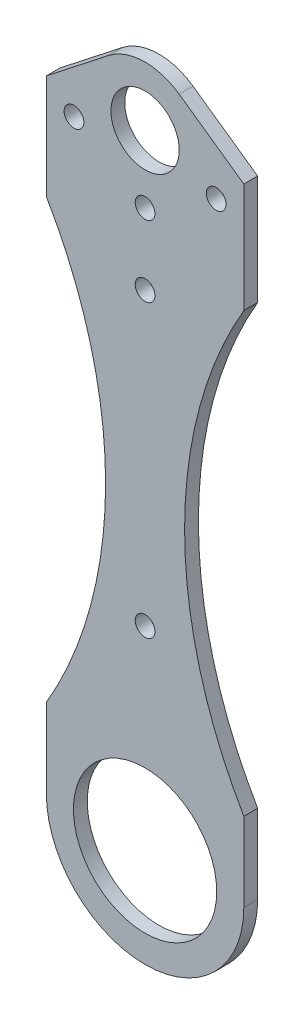
ISO-10303-21;
HEADER;
FILE_DESCRIPTION(('STEP AP214'),'2;1');
FILE_NAME('part.step','',(''),(''),'','','');
FILE_SCHEMA(('AUTOMOTIVE_DESIGN { 1 0 10303 214 1 1 1 1 }'));
ENDSEC;
DATA;
#1=APPLICATION_CONTEXT('core data for automotive mechanical design processes');
#2=APPLICATION_PROTOCOL_DEFINITION('international standard','automotive_design',2000,#1);
#3=PRODUCT_CONTEXT('',#1,'mechanical');
#4=PRODUCT('Part','Part','',(#3));
#5=PRODUCT_RELATED_PRODUCT_CATEGORY('part','',(#4));
#6=PRODUCT_DEFINITION_FORMATION('','',#4);
#7=PRODUCT_DEFINITION_CONTEXT('part definition',#1,'design');
#8=PRODUCT_DEFINITION('design','',#6,#7);
#9=PRODUCT_DEFINITION_SHAPE('','',#8);
#10=(LENGTH_UNIT() NAMED_UNIT(*) SI_UNIT(.MILLI.,.METRE.));
#11=(NAMED_UNIT(*) PLANE_ANGLE_UNIT() SI_UNIT($,.RADIAN.));
#12=(NAMED_UNIT(*) SI_UNIT($,.STERADIAN.) SOLID_ANGLE_UNIT());
#13=UNCERTAINTY_MEASURE_WITH_UNIT(LENGTH_MEASURE(1.E-05),#10,'distance_accuracy_value','');
#14=(GEOMETRIC_REPRESENTATION_CONTEXT(3) GLOBAL_UNCERTAINTY_ASSIGNED_CONTEXT((#13)) GLOBAL_UNIT_ASSIGNED_CONTEXT((#10,
#11,#12)) REPRESENTATION_CONTEXT('',''));
#15=CARTESIAN_POINT('',(0.,0.,0.));
#16=DIRECTION('',(0.,0.,1.));
#17=DIRECTION('',(1.,0.,0.));
#18=AXIS2_PLACEMENT_3D('',#15,#16,#17);
#19=CARTESIAN_POINT('',(-31.75,0.,4.445));
#20=DIRECTION('',(1.,0.,0.));
#21=DIRECTION('',(0.,1.,0.));
#22=AXIS2_PLACEMENT_3D('',#19,#20,#21);
#23=PLANE('',#22);
#24=DIRECTION('',(0.,0.,-1.));
#25=VECTOR('',#24,1.);
#26=CARTESIAN_POINT('',(-31.75,86.8881921154927,4.445));
#27=LINE('',#26,#25);
#28=CARTESIAN_POINT('',(-31.75,86.8881921154927,4.445));
#29=VERTEX_POINT('',#28);
#30=CARTESIAN_POINT('',(-31.75,86.8881921154927,0.));
#31=VERTEX_POINT('',#30);
#32=EDGE_CURVE('E255',#29,#31,#27,.T.);
#33=ORIENTED_EDGE('',*,*,#32,.T.);
#34=DIRECTION('',(0.,-1.,0.));
#35=VECTOR('',#34,1.);
#36=CARTESIAN_POINT('',(-31.75,0.,0.));
#37=LINE('',#36,#35);
#38=CARTESIAN_POINT('',(-31.75,53.2765,0.));
#39=VERTEX_POINT('',#38);
#40=EDGE_CURVE('E159',#31,#39,#37,.T.);
#41=ORIENTED_EDGE('',*,*,#40,.T.);
#42=DIRECTION('',(0.,0.,-1.));
#43=VECTOR('',#42,1.);
#44=CARTESIAN_POINT('',(-31.75,53.2765,4.445));
#45=LINE('',#44,#43);
#46=CARTESIAN_POINT('',(-31.75,53.2765,4.445));
#47=VERTEX_POINT('',#46);
#48=EDGE_CURVE('E116',#47,#39,#45,.T.);
#49=ORIENTED_EDGE('',*,*,#48,.F.);
#50=DIRECTION('',(0.,-1.,0.));
#51=VECTOR('',#50,1.);
#52=CARTESIAN_POINT('',(-31.75,0.,4.445));
#53=LINE('',#52,#51);
#54=EDGE_CURVE('E124',#29,#47,#53,.T.);
#55=ORIENTED_EDGE('',*,*,#54,.F.);
#56=EDGE_LOOP('',(#33,#41,#49,#55));
#57=FACE_BOUND('',#56,.T.);
#58=ADVANCED_FACE('F37',(#57),#23,.F.);
#59=CARTESIAN_POINT('',(31.75,0.,4.445));
#60=DIRECTION('',(1.,0.,0.));
#61=DIRECTION('',(0.,1.,0.));
#62=AXIS2_PLACEMENT_3D('',#59,#60,#61);
#63=PLANE('',#62);
#64=DIRECTION('',(0.,-1.,0.));
#65=VECTOR('',#64,1.);
#66=CARTESIAN_POINT('',(31.75,0.,0.));
#67=LINE('',#66,#65);
#68=CARTESIAN_POINT('',(31.75,-87.5664999999999,0.));
#69=VERTEX_POINT('',#68);
#70=CARTESIAN_POINT('',(31.75,-112.9665,0.));
#71=VERTEX_POINT('',#70);
#72=EDGE_CURVE('E152',#69,#71,#67,.T.);
#73=ORIENTED_EDGE('',*,*,#72,.F.);
#74=DIRECTION('',(0.,0.,-1.));
#75=VECTOR('',#74,1.);
#76=CARTESIAN_POINT('',(31.75,-87.5664999999999,4.445));
#77=LINE('',#76,#75);
#78=CARTESIAN_POINT('',(31.75,-87.5664999999999,4.445));
#79=VERTEX_POINT('',#78);
#80=EDGE_CURVE('E11',#79,#69,#77,.T.);
#81=ORIENTED_EDGE('',*,*,#80,.F.);
#82=DIRECTION('',(0.,-1.,0.));
#83=VECTOR('',#82,1.);
#84=CARTESIAN_POINT('',(31.75,0.,4.445));
#85=LINE('',#84,#83);
#86=CARTESIAN_POINT('',(31.75,-112.9665,4.445));
#87=VERTEX_POINT('',#86);
#88=EDGE_CURVE('E284',#79,#87,#85,.T.);
#89=ORIENTED_EDGE('',*,*,#88,.T.);
#90=DIRECTION('',(0.,0.,-1.));
#91=VECTOR('',#90,1.);
#92=CARTESIAN_POINT('',(31.75,-112.9665,4.445));
#93=LINE('',#92,#91);
#94=EDGE_CURVE('E87',#87,#71,#93,.T.);
#95=ORIENTED_EDGE('',*,*,#94,.T.);
#96=EDGE_LOOP('',(#73,#81,#89,#95));
#97=FACE_BOUND('',#96,.T.);
#98=ADVANCED_FACE('F183',(#97),#63,.T.);
#99=CARTESIAN_POINT('',(152.387405833333,-17.1449999999999,4.445));
#100=DIRECTION('',(0.,0.,-1.));
#101=DIRECTION('',(-1.,0.,0.));
#102=AXIS2_PLACEMENT_3D('',#99,#100,#101);
#103=CYLINDRICAL_SURFACE('',#102,139.687405833333);
#104=CARTESIAN_POINT('',(152.387405833333,-17.1449999999999,0.));
#105=DIRECTION('',(0.,0.,1.));
#106=DIRECTION('',(1.,0.,0.));
#107=AXIS2_PLACEMENT_3D('',#104,#105,#106);
#108=CIRCLE('',#107,139.687405833333);
#109=CARTESIAN_POINT('',(31.75,53.2765,0.));
#110=VERTEX_POINT('',#109);
#111=EDGE_CURVE('E155',#69,#110,#108,.F.);
#112=ORIENTED_EDGE('',*,*,#111,.T.);
#113=DIRECTION('',(0.,0.,-1.));
#114=VECTOR('',#113,1.);
#115=CARTESIAN_POINT('',(31.75,53.2765,4.445));
#116=LINE('',#115,#114);
#117=CARTESIAN_POINT('',(31.75,53.2765,4.445));
#118=VERTEX_POINT('',#117);
#119=EDGE_CURVE('E45',#118,#110,#116,.T.);
#120=ORIENTED_EDGE('',*,*,#119,.F.);
#121=CARTESIAN_POINT('',(152.387405833333,-17.1449999999999,4.445));
#122=DIRECTION('',(0.,0.,1.));
#123=DIRECTION('',(1.,0.,0.));
#124=AXIS2_PLACEMENT_3D('',#121,#122,#123);
#125=CIRCLE('',#124,139.687405833333);
#126=EDGE_CURVE('E285',#79,#118,#125,.F.);
#127=ORIENTED_EDGE('',*,*,#126,.F.);
#128=ORIENTED_EDGE('',*,*,#80,.T.);
#129=EDGE_LOOP('',(#112,#120,#127,#128));
#130=FACE_BOUND('',#129,.T.);
#131=ADVANCED_FACE('F179',(#130),#103,.F.);
#132=DIRECTION('',(0.,0.,-1.));
#133=VECTOR('',#132,1.);
#134=CARTESIAN_POINT('',(31.75,88.5216000626217,4.445));
#135=LINE('',#134,#133);
#136=CARTESIAN_POINT('',(31.75,88.5216000626217,4.445));
#137=VERTEX_POINT('',#136);
#138=CARTESIAN_POINT('',(31.75,88.5216000626217,0.));
#139=VERTEX_POINT('',#138);
#140=EDGE_CURVE('E238',#137,#139,#135,.T.);
#141=ORIENTED_EDGE('',*,*,#140,.F.);
#142=EDGE_CURVE('E132',#137,#118,#85,.T.);
#143=ORIENTED_EDGE('',*,*,#142,.T.);
#144=ORIENTED_EDGE('',*,*,#119,.T.);
#145=EDGE_CURVE('E156',#139,#110,#67,.T.);
#146=ORIENTED_EDGE('',*,*,#145,.F.);
#147=EDGE_LOOP('',(#141,#143,#144,#146));
#148=FACE_BOUND('',#147,.T.);
#149=ADVANCED_FACE('F173',(#148),#63,.T.);
#150=CARTESIAN_POINT('',(-152.387405833333,-17.145,4.445));
#151=DIRECTION('',(0.,0.,-1.));
#152=DIRECTION('',(-1.,0.,0.));
#153=AXIS2_PLACEMENT_3D('',#150,#151,#152);
#154=CYLINDRICAL_SURFACE('',#153,139.687405833333);
#155=CARTESIAN_POINT('',(-152.387405833333,-17.145,0.));
#156=DIRECTION('',(0.,0.,1.));
#157=DIRECTION('',(1.,0.,0.));
#158=AXIS2_PLACEMENT_3D('',#155,#156,#157);
#159=CIRCLE('',#158,139.687405833333);
#160=CARTESIAN_POINT('',(-31.75,-87.5664999999999,0.));
#161=VERTEX_POINT('',#160);
#162=EDGE_CURVE('E112',#161,#39,#159,.T.);
#163=ORIENTED_EDGE('',*,*,#162,.F.);
#164=DIRECTION('',(0.,0.,-1.));
#165=VECTOR('',#164,1.);
#166=CARTESIAN_POINT('',(-31.75,-87.5664999999999,4.445));
#167=LINE('',#166,#165);
#168=CARTESIAN_POINT('',(-31.75,-87.5664999999999,4.445));
#169=VERTEX_POINT('',#168);
#170=EDGE_CURVE('E105',#169,#161,#167,.T.);
#171=ORIENTED_EDGE('',*,*,#170,.F.);
#172=CARTESIAN_POINT('',(-152.387405833333,-17.145,4.445));
#173=DIRECTION('',(0.,0.,1.));
#174=DIRECTION('',(1.,0.,0.));
#175=AXIS2_PLACEMENT_3D('',#172,#173,#174);
#176=CIRCLE('',#175,139.687405833333);
#177=EDGE_CURVE('E110',#169,#47,#176,.T.);
#178=ORIENTED_EDGE('',*,*,#177,.T.);
#179=ORIENTED_EDGE('',*,*,#48,.T.);
#180=EDGE_LOOP('',(#163,#171,#178,#179));
#181=FACE_BOUND('',#180,.T.);
#182=ADVANCED_FACE('F107',(#181),#154,.F.);
#183=CARTESIAN_POINT('',(-31.75,-112.9665,0.));
#184=VERTEX_POINT('',#183);
#185=EDGE_CURVE('E161',#161,#184,#37,.T.);
#186=ORIENTED_EDGE('',*,*,#185,.T.);
#187=DIRECTION('',(0.,0.,-1.));
#188=VECTOR('',#187,1.);
#189=CARTESIAN_POINT('',(-31.75,-112.9665,4.445));
#190=LINE('',#189,#188);
#191=CARTESIAN_POINT('',(-31.75,-112.9665,4.445));
#192=VERTEX_POINT('',#191);
#193=EDGE_CURVE('E117',#192,#184,#190,.T.);
#194=ORIENTED_EDGE('',*,*,#193,.F.);
#195=EDGE_CURVE('E120',#169,#192,#53,.T.);
#196=ORIENTED_EDGE('',*,*,#195,.F.);
#197=ORIENTED_EDGE('',*,*,#170,.T.);
#198=EDGE_LOOP('',(#186,#194,#196,#197));
#199=FACE_BOUND('',#198,.T.);
#200=ADVANCED_FACE('F121',(#199),#23,.F.);
#201=CARTESIAN_POINT('',(22.86,79.9465000000001,4.445));
#202=DIRECTION('',(0.,0.,-1.));
#203=DIRECTION('',(-1.,0.,0.));
#204=AXIS2_PLACEMENT_3D('',#201,#202,#203);
#205=CYLINDRICAL_SURFACE('',#204,3.175);
#206=CARTESIAN_POINT('',(22.86,79.9465000000001,4.445));
#207=DIRECTION('',(0.,0.,1.));
#208=DIRECTION('',(1.,0.,0.));
#209=AXIS2_PLACEMENT_3D('',#206,#207,#208);
#210=CIRCLE('',#209,3.175);
#211=CARTESIAN_POINT('',(26.035,79.9465000000001,4.445));
#212=VERTEX_POINT('',#211);
#213=EDGE_CURVE('E281',#212,#212,#210,.T.);
#214=ORIENTED_EDGE('',*,*,#213,.T.);
#215=EDGE_LOOP('',(#214));
#216=FACE_BOUND('',#215,.T.);
#217=CARTESIAN_POINT('',(22.86,79.9465000000001,0.));
#218=DIRECTION('',(0.,0.,1.));
#219=DIRECTION('',(1.,0.,0.));
#220=AXIS2_PLACEMENT_3D('',#217,#218,#219);
#221=CIRCLE('',#220,3.175);
#222=CARTESIAN_POINT('',(26.035,79.9465000000001,0.));
#223=VERTEX_POINT('',#222);
#224=EDGE_CURVE('E149',#223,#223,#221,.T.);
#225=ORIENTED_EDGE('',*,*,#224,.F.);
#226=EDGE_LOOP('',(#225));
#227=FACE_BOUND('',#226,.T.);
#228=ADVANCED_FACE('F201',(#216,#227),#205,.F.);
#229=CARTESIAN_POINT('',(-22.86,79.9465000000001,4.445));
#230=DIRECTION('',(0.,0.,-1.));
#231=DIRECTION('',(-1.,0.,0.));
#232=AXIS2_PLACEMENT_3D('',#229,#230,#231);
#233=CYLINDRICAL_SURFACE('',#232,3.175);
#234=CARTESIAN_POINT('',(-22.86,79.9465000000001,4.445));
#235=DIRECTION('',(0.,0.,1.));
#236=DIRECTION('',(1.,0.,0.));
#237=AXIS2_PLACEMENT_3D('',#234,#235,#236);
#238=CIRCLE('',#237,3.175);
#239=CARTESIAN_POINT('',(-19.685,79.9465000000001,4.445));
#240=VERTEX_POINT('',#239);
#241=EDGE_CURVE('E278',#240,#240,#238,.T.);
#242=ORIENTED_EDGE('',*,*,#241,.T.);
#243=EDGE_LOOP('',(#242));
#244=FACE_BOUND('',#243,.T.);
#245=CARTESIAN_POINT('',(-22.86,79.9465000000001,0.));
#246=DIRECTION('',(0.,0.,1.));
#247=DIRECTION('',(1.,0.,0.));
#248=AXIS2_PLACEMENT_3D('',#245,#246,#247);
#249=CIRCLE('',#248,3.175);
#250=CARTESIAN_POINT('',(-19.685,79.9465000000001,0.));
#251=VERTEX_POINT('',#250);
#252=EDGE_CURVE('E146',#251,#251,#249,.T.);
#253=ORIENTED_EDGE('',*,*,#252,.F.);
#254=EDGE_LOOP('',(#253));
#255=FACE_BOUND('',#254,.T.);
#256=ADVANCED_FACE('F305',(#244,#255),#233,.F.);
#257=CARTESIAN_POINT('',(0.,65.9765,4.445));
#258=DIRECTION('',(0.,0.,-1.));
#259=DIRECTION('',(-1.,0.,0.));
#260=AXIS2_PLACEMENT_3D('',#257,#258,#259);
#261=CYLINDRICAL_SURFACE('',#260,3.175);
#262=CARTESIAN_POINT('',(0.,65.9765,4.445));
#263=DIRECTION('',(0.,0.,1.));
#264=DIRECTION('',(1.,0.,0.));
#265=AXIS2_PLACEMENT_3D('',#262,#263,#264);
#266=CIRCLE('',#265,3.175);
#267=CARTESIAN_POINT('',(3.175,65.9765,4.445));
#268=VERTEX_POINT('',#267);
#269=EDGE_CURVE('E275',#268,#268,#266,.T.);
#270=ORIENTED_EDGE('',*,*,#269,.T.);
#271=EDGE_LOOP('',(#270));
#272=FACE_BOUND('',#271,.T.);
#273=CARTESIAN_POINT('',(0.,65.9765,0.));
#274=DIRECTION('',(0.,0.,1.));
#275=DIRECTION('',(1.,0.,0.));
#276=AXIS2_PLACEMENT_3D('',#273,#274,#275);
#277=CIRCLE('',#276,3.175);
#278=CARTESIAN_POINT('',(3.175,65.9765,0.));
#279=VERTEX_POINT('',#278);
#280=EDGE_CURVE('E143',#279,#279,#277,.T.);
#281=ORIENTED_EDGE('',*,*,#280,.F.);
#282=EDGE_LOOP('',(#281));
#283=FACE_BOUND('',#282,.T.);
#284=ADVANCED_FACE('F312',(#272,#283),#261,.F.);
#285=CARTESIAN_POINT('',(0.,87.5665,4.445));
#286=DIRECTION('',(0.,0.,-1.));
#287=DIRECTION('',(-1.,0.,0.));
#288=AXIS2_PLACEMENT_3D('',#285,#286,#287);
#289=CYLINDRICAL_SURFACE('',#288,10.9855);
#290=CARTESIAN_POINT('',(0.,87.5665,4.445));
#291=DIRECTION('',(0.,0.,1.));
#292=DIRECTION('',(1.,0.,0.));
#293=AXIS2_PLACEMENT_3D('',#290,#291,#292);
#294=CIRCLE('',#293,10.9855);
#295=CARTESIAN_POINT('',(10.9855,87.5665,4.445));
#296=VERTEX_POINT('',#295);
#297=EDGE_CURVE('E272',#296,#296,#294,.T.);
#298=ORIENTED_EDGE('',*,*,#297,.T.);
#299=EDGE_LOOP('',(#298));
#300=FACE_BOUND('',#299,.T.);
#301=CARTESIAN_POINT('',(0.,87.5665,0.));
#302=DIRECTION('',(0.,0.,1.));
#303=DIRECTION('',(1.,0.,0.));
#304=AXIS2_PLACEMENT_3D('',#301,#302,#303);
#305=CIRCLE('',#304,10.9855);
#306=CARTESIAN_POINT('',(10.9855,87.5665,0.));
#307=VERTEX_POINT('',#306);
#308=EDGE_CURVE('E139',#307,#307,#305,.T.);
#309=ORIENTED_EDGE('',*,*,#308,.F.);
#310=EDGE_LOOP('',(#309));
#311=FACE_BOUND('',#310,.T.);
#312=ADVANCED_FACE('F317',(#300,#311),#289,.F.);
#313=CARTESIAN_POINT('',(0.,-112.9665,4.445));
#314=DIRECTION('',(0.,0.,-1.));
#315=DIRECTION('',(-1.,0.,0.));
#316=AXIS2_PLACEMENT_3D('',#313,#314,#315);
#317=CYLINDRICAL_SURFACE('',#316,23.0378);
#318=CARTESIAN_POINT('',(0.,-112.9665,4.445));
#319=DIRECTION('',(0.,0.,1.));
#320=DIRECTION('',(1.,0.,0.));
#321=AXIS2_PLACEMENT_3D('',#318,#319,#320);
#322=CIRCLE('',#321,23.0378);
#323=CARTESIAN_POINT('',(23.0378,-112.9665,4.445));
#324=VERTEX_POINT('',#323);
#325=EDGE_CURVE('E165',#324,#324,#322,.T.);
#326=ORIENTED_EDGE('',*,*,#325,.T.);
#327=EDGE_LOOP('',(#326));
#328=FACE_BOUND('',#327,.T.);
#329=CARTESIAN_POINT('',(0.,-112.9665,0.));
#330=DIRECTION('',(0.,0.,1.));
#331=DIRECTION('',(1.,0.,0.));
#332=AXIS2_PLACEMENT_3D('',#329,#330,#331);
#333=CIRCLE('',#332,23.0378);
#334=CARTESIAN_POINT('',(23.0378,-112.9665,0.));
#335=VERTEX_POINT('',#334);
#336=EDGE_CURVE('E136',#335,#335,#333,.T.);
#337=ORIENTED_EDGE('',*,*,#336,.F.);
#338=EDGE_LOOP('',(#337));
#339=FACE_BOUND('',#338,.T.);
#340=ADVANCED_FACE('F39',(#328,#339),#317,.F.);
#341=CARTESIAN_POINT('',(0.,-112.9665,4.445));
#342=DIRECTION('',(0.,0.,-1.));
#343=DIRECTION('',(-1.,0.,0.));
#344=AXIS2_PLACEMENT_3D('',#341,#342,#343);
#345=CYLINDRICAL_SURFACE('',#344,31.75);
#346=CARTESIAN_POINT('',(0.,-112.9665,0.));
#347=DIRECTION('',(0.,0.,1.));
#348=DIRECTION('',(1.,0.,0.));
#349=AXIS2_PLACEMENT_3D('',#346,#347,#348);
#350=CIRCLE('',#349,31.75);
#351=EDGE_CURVE('E163',#184,#71,#350,.T.);
#352=ORIENTED_EDGE('',*,*,#351,.T.);
#353=ORIENTED_EDGE('',*,*,#94,.F.);
#354=CARTESIAN_POINT('',(0.,-112.9665,4.445));
#355=DIRECTION('',(0.,0.,1.));
#356=DIRECTION('',(1.,0.,0.));
#357=AXIS2_PLACEMENT_3D('',#354,#355,#356);
#358=CIRCLE('',#357,31.75);
#359=EDGE_CURVE('E61',#192,#87,#358,.T.);
#360=ORIENTED_EDGE('',*,*,#359,.F.);
#361=ORIENTED_EDGE('',*,*,#193,.T.);
#362=EDGE_LOOP('',(#352,#353,#360,#361));
#363=FACE_BOUND('',#362,.T.);
#364=ADVANCED_FACE('F203',(#363),#345,.T.);
#365=CARTESIAN_POINT('',(0.,0.,4.445));
#366=DIRECTION('',(0.,0.,1.));
#367=DIRECTION('',(1.,0.,0.));
#368=AXIS2_PLACEMENT_3D('',#365,#366,#367);
#369=PLANE('',#368);
#370=DIRECTION('',(-0.817874399318846,0.575396790865953,0.));
#371=VECTOR('',#370,1.);
#372=CARTESIAN_POINT('',(52.1703055804637,74.1553620323244,4.445));
#373=LINE('',#372,#371);
#374=CARTESIAN_POINT('',(10.9613088659964,103.147007307024,4.445));
#375=VERTEX_POINT('',#374);
#376=EDGE_CURVE('E249',#137,#375,#373,.T.);
#377=ORIENTED_EDGE('',*,*,#376,.T.);
#378=CARTESIAN_POINT('',(0.,87.5665000000001,4.445));
#379=DIRECTION('',(0.,0.,-1.));
#380=DIRECTION('',(-1.,0.,0.));
#381=AXIS2_PLACEMENT_3D('',#378,#379,#380);
#382=CIRCLE('',#381,19.05);
#383=CARTESIAN_POINT('',(-11.7503407514417,102.560898695013,4.445));
#384=VERTEX_POINT('',#383);
#385=EDGE_CURVE('E240',#384,#375,#382,.T.);
#386=ORIENTED_EDGE('',*,*,#385,.F.);
#387=DIRECTION('',(0.787107543045303,0.616815787477256,0.));
#388=VECTOR('',#387,1.);
#389=CARTESIAN_POINT('',(-54.2639079371827,69.2451978688164,4.445));
#390=LINE('',#389,#388);
#391=EDGE_CURVE('E298',#29,#384,#390,.T.);
#392=ORIENTED_EDGE('',*,*,#391,.F.);
#393=ORIENTED_EDGE('',*,*,#54,.T.);
#394=ORIENTED_EDGE('',*,*,#177,.F.);
#395=ORIENTED_EDGE('',*,*,#195,.T.);
#396=ORIENTED_EDGE('',*,*,#359,.T.);
#397=ORIENTED_EDGE('',*,*,#88,.F.);
#398=ORIENTED_EDGE('',*,*,#126,.T.);
#399=ORIENTED_EDGE('',*,*,#142,.F.);
#400=EDGE_LOOP('',(#377,#386,#392,#393,#394,#395,#396,#397,#398,#399));
#401=FACE_BOUND('',#400,.T.);
#402=CARTESIAN_POINT('',(0.,-50.4189999999999,4.445));
#403=DIRECTION('',(0.,0.,1.));
#404=DIRECTION('',(1.,0.,0.));
#405=AXIS2_PLACEMENT_3D('',#402,#403,#404);
#406=CIRCLE('',#405,3.175);
#407=CARTESIAN_POINT('',(3.175,-50.4189999999999,4.445));
#408=VERTEX_POINT('',#407);
#409=EDGE_CURVE('E253',#408,#408,#406,.T.);
#410=ORIENTED_EDGE('',*,*,#409,.F.);
#411=EDGE_LOOP('',(#410));
#412=FACE_BOUND('',#411,.T.);
#413=CARTESIAN_POINT('',(0.,43.1165000000001,4.445));
#414=DIRECTION('',(0.,0.,1.));
#415=DIRECTION('',(1.,0.,0.));
#416=AXIS2_PLACEMENT_3D('',#413,#414,#415);
#417=CIRCLE('',#416,3.175);
#418=CARTESIAN_POINT('',(3.175,43.1165000000001,4.445));
#419=VERTEX_POINT('',#418);
#420=EDGE_CURVE('E263',#419,#419,#417,.T.);
#421=ORIENTED_EDGE('',*,*,#420,.F.);
#422=EDGE_LOOP('',(#421));
#423=FACE_BOUND('',#422,.T.);
#424=ORIENTED_EDGE('',*,*,#325,.F.);
#425=EDGE_LOOP('',(#424));
#426=FACE_BOUND('',#425,.T.);
#427=ORIENTED_EDGE('',*,*,#297,.F.);
#428=EDGE_LOOP('',(#427));
#429=FACE_BOUND('',#428,.T.);
#430=ORIENTED_EDGE('',*,*,#269,.F.);
#431=EDGE_LOOP('',(#430));
#432=FACE_BOUND('',#431,.T.);
#433=ORIENTED_EDGE('',*,*,#241,.F.);
#434=EDGE_LOOP('',(#433));
#435=FACE_BOUND('',#434,.T.);
#436=ORIENTED_EDGE('',*,*,#213,.F.);
#437=EDGE_LOOP('',(#436));
#438=FACE_BOUND('',#437,.T.);
#439=ADVANCED_FACE('F126',(#401,#412,#423,#426,#429,#432,#435,#438),#369,.T.);
#440=CARTESIAN_POINT('',(0.,0.,0.));
#441=DIRECTION('',(0.,0.,1.));
#442=DIRECTION('',(1.,0.,0.));
#443=AXIS2_PLACEMENT_3D('',#440,#441,#442);
#444=PLANE('',#443);
#445=CARTESIAN_POINT('',(0.,-50.4189999999999,0.));
#446=DIRECTION('',(0.,0.,1.));
#447=DIRECTION('',(1.,0.,0.));
#448=AXIS2_PLACEMENT_3D('',#445,#446,#447);
#449=CIRCLE('',#448,3.175);
#450=CARTESIAN_POINT('',(3.175,-50.4189999999999,0.));
#451=VERTEX_POINT('',#450);
#452=EDGE_CURVE('E260',#451,#451,#449,.T.);
#453=ORIENTED_EDGE('',*,*,#452,.T.);
#454=EDGE_LOOP('',(#453));
#455=FACE_BOUND('',#454,.T.);
#456=CARTESIAN_POINT('',(0.,43.1165000000001,0.));
#457=DIRECTION('',(0.,0.,1.));
#458=DIRECTION('',(1.,0.,0.));
#459=AXIS2_PLACEMENT_3D('',#456,#457,#458);
#460=CIRCLE('',#459,3.175);
#461=CARTESIAN_POINT('',(3.175,43.1165000000001,0.));
#462=VERTEX_POINT('',#461);
#463=EDGE_CURVE('E140',#462,#462,#460,.T.);
#464=ORIENTED_EDGE('',*,*,#463,.T.);
#465=EDGE_LOOP('',(#464));
#466=FACE_BOUND('',#465,.T.);
#467=ORIENTED_EDGE('',*,*,#336,.T.);
#468=EDGE_LOOP('',(#467));
#469=FACE_BOUND('',#468,.T.);
#470=ORIENTED_EDGE('',*,*,#308,.T.);
#471=EDGE_LOOP('',(#470));
#472=FACE_BOUND('',#471,.T.);
#473=ORIENTED_EDGE('',*,*,#280,.T.);
#474=EDGE_LOOP('',(#473));
#475=FACE_BOUND('',#474,.T.);
#476=ORIENTED_EDGE('',*,*,#252,.T.);
#477=EDGE_LOOP('',(#476));
#478=FACE_BOUND('',#477,.T.);
#479=ORIENTED_EDGE('',*,*,#224,.T.);
#480=EDGE_LOOP('',(#479));
#481=FACE_BOUND('',#480,.T.);
#482=CARTESIAN_POINT('',(0.,87.5665000000001,0.));
#483=DIRECTION('',(0.,0.,-1.));
#484=DIRECTION('',(-1.,0.,0.));
#485=AXIS2_PLACEMENT_3D('',#482,#483,#484);
#486=CIRCLE('',#485,19.05);
#487=CARTESIAN_POINT('',(-11.7503407514417,102.560898695013,0.));
#488=VERTEX_POINT('',#487);
#489=CARTESIAN_POINT('',(10.9613088659964,103.147007307024,0.));
#490=VERTEX_POINT('',#489);
#491=EDGE_CURVE('E52',#488,#490,#486,.T.);
#492=ORIENTED_EDGE('',*,*,#491,.T.);
#493=DIRECTION('',(-0.817874399318846,0.575396790865953,0.));
#494=VECTOR('',#493,1.);
#495=CARTESIAN_POINT('',(52.1703055804637,74.1553620323244,0.));
#496=LINE('',#495,#494);
#497=EDGE_CURVE('E235',#139,#490,#496,.T.);
#498=ORIENTED_EDGE('',*,*,#497,.F.);
#499=ORIENTED_EDGE('',*,*,#145,.T.);
#500=ORIENTED_EDGE('',*,*,#111,.F.);
#501=ORIENTED_EDGE('',*,*,#72,.T.);
#502=ORIENTED_EDGE('',*,*,#351,.F.);
#503=ORIENTED_EDGE('',*,*,#185,.F.);
#504=ORIENTED_EDGE('',*,*,#162,.T.);
#505=ORIENTED_EDGE('',*,*,#40,.F.);
#506=DIRECTION('',(0.787107543045303,0.616815787477256,0.));
#507=VECTOR('',#506,1.);
#508=CARTESIAN_POINT('',(-54.2639079371827,69.2451978688164,0.));
#509=LINE('',#508,#507);
#510=EDGE_CURVE('E241',#31,#488,#509,.T.);
#511=ORIENTED_EDGE('',*,*,#510,.T.);
#512=EDGE_LOOP('',(#492,#498,#499,#500,#501,#502,#503,#504,#505,#511));
#513=FACE_BOUND('',#512,.T.);
#514=ADVANCED_FACE('F181',(#455,#466,#469,#472,#475,#478,#481,#513),#444,.F.);
#515=CARTESIAN_POINT('',(0.,43.1165000000001,0.));
#516=DIRECTION('',(0.,0.,1.));
#517=DIRECTION('',(1.,0.,0.));
#518=AXIS2_PLACEMENT_3D('',#515,#516,#517);
#519=CYLINDRICAL_SURFACE('',#518,3.175);
#520=ORIENTED_EDGE('',*,*,#463,.F.);
#521=EDGE_LOOP('',(#520));
#522=FACE_BOUND('',#521,.T.);
#523=ORIENTED_EDGE('',*,*,#420,.T.);
#524=EDGE_LOOP('',(#523));
#525=FACE_BOUND('',#524,.T.);
#526=ADVANCED_FACE('F209',(#522,#525),#519,.F.);
#527=CARTESIAN_POINT('',(0.,-50.4189999999999,0.));
#528=DIRECTION('',(0.,0.,1.));
#529=DIRECTION('',(1.,0.,0.));
#530=AXIS2_PLACEMENT_3D('',#527,#528,#529);
#531=CYLINDRICAL_SURFACE('',#530,3.175);
#532=ORIENTED_EDGE('',*,*,#452,.F.);
#533=EDGE_LOOP('',(#532));
#534=FACE_BOUND('',#533,.T.);
#535=ORIENTED_EDGE('',*,*,#409,.T.);
#536=EDGE_LOOP('',(#535));
#537=FACE_BOUND('',#536,.T.);
#538=ADVANCED_FACE('F215',(#534,#537),#531,.F.);
#539=CARTESIAN_POINT('',(0.,87.5665000000001,4.445));
#540=DIRECTION('',(0.,0.,-1.));
#541=DIRECTION('',(-1.,0.,0.));
#542=AXIS2_PLACEMENT_3D('',#539,#540,#541);
#543=CYLINDRICAL_SURFACE('',#542,19.05);
#544=ORIENTED_EDGE('',*,*,#491,.F.);
#545=DIRECTION('',(0.,0.,-1.));
#546=VECTOR('',#545,1.);
#547=CARTESIAN_POINT('',(-11.7503407514417,102.560898695013,4.445));
#548=LINE('',#547,#546);
#549=EDGE_CURVE('E258',#384,#488,#548,.T.);
#550=ORIENTED_EDGE('',*,*,#549,.F.);
#551=ORIENTED_EDGE('',*,*,#385,.T.);
#552=DIRECTION('',(0.,0.,-1.));
#553=VECTOR('',#552,1.);
#554=CARTESIAN_POINT('',(10.9613088659964,103.147007307024,4.445));
#555=LINE('',#554,#553);
#556=EDGE_CURVE('E237',#375,#490,#555,.T.);
#557=ORIENTED_EDGE('',*,*,#556,.T.);
#558=EDGE_LOOP('',(#544,#550,#551,#557));
#559=FACE_BOUND('',#558,.T.);
#560=ADVANCED_FACE('F219',(#559),#543,.T.);
#561=CARTESIAN_POINT('',(52.1703055804637,74.1553620323244,4.445));
#562=DIRECTION('',(-0.575396790865953,-0.817874399318846,0.));
#563=DIRECTION('',(0.817874399318846,-0.575396790865953,0.));
#564=AXIS2_PLACEMENT_3D('',#561,#562,#563);
#565=PLANE('',#564);
#566=ORIENTED_EDGE('',*,*,#497,.T.);
#567=ORIENTED_EDGE('',*,*,#556,.F.);
#568=ORIENTED_EDGE('',*,*,#376,.F.);
#569=ORIENTED_EDGE('',*,*,#140,.T.);
#570=EDGE_LOOP('',(#566,#567,#568,#569));
#571=FACE_BOUND('',#570,.T.);
#572=ADVANCED_FACE('F223',(#571),#565,.F.);
#573=CARTESIAN_POINT('',(-54.2639079371827,69.2451978688164,4.445));
#574=DIRECTION('',(-0.616815787477256,0.787107543045303,0.));
#575=DIRECTION('',(-0.787107543045303,-0.616815787477256,0.));
#576=AXIS2_PLACEMENT_3D('',#573,#574,#575);
#577=PLANE('',#576);
#578=ORIENTED_EDGE('',*,*,#510,.F.);
#579=ORIENTED_EDGE('',*,*,#32,.F.);
#580=ORIENTED_EDGE('',*,*,#391,.T.);
#581=ORIENTED_EDGE('',*,*,#549,.T.);
#582=EDGE_LOOP('',(#578,#579,#580,#581));
#583=FACE_BOUND('',#582,.T.);
#584=ADVANCED_FACE('F224',(#583),#577,.T.);
#585=CLOSED_SHELL('',(#58,#98,#131,#149,#182,#200,#228,#256,#284,#312,#340,#364,#439,#514,#526,
#538,#560,#572,#584));
#586=MANIFOLD_SOLID_BREP('B2',#585);
#587=ADVANCED_BREP_SHAPE_REPRESENTATION('',(#18,#586),#14);
#588=SHAPE_DEFINITION_REPRESENTATION(#9,#587);
ENDSEC;
END-ISO-10303-21;
